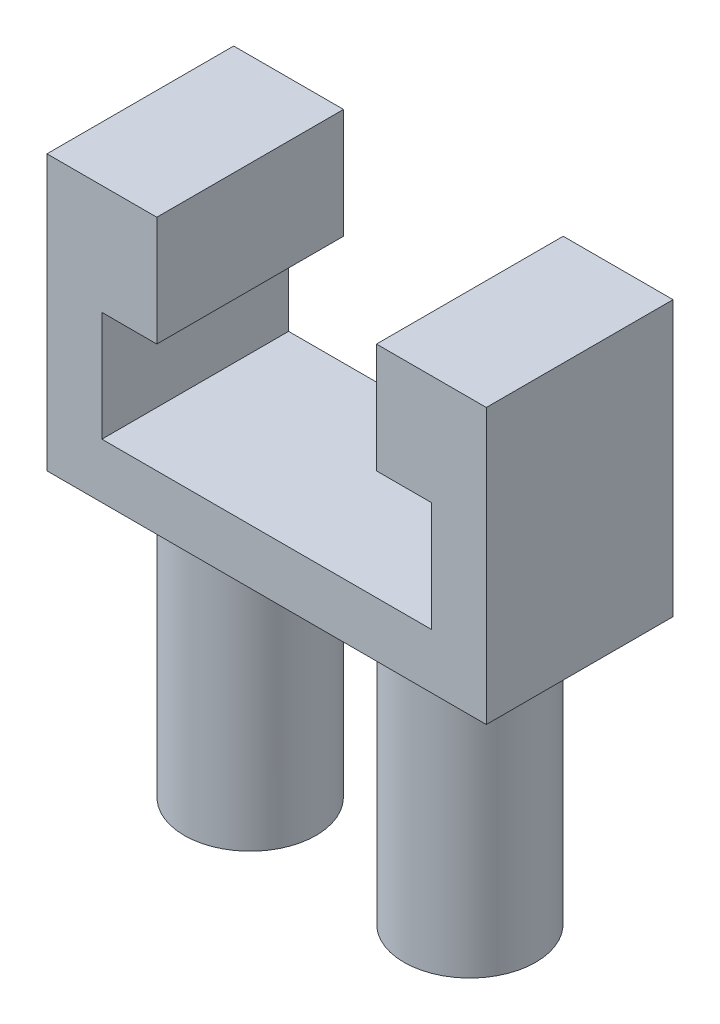
ISO-10303-21;
HEADER;
FILE_DESCRIPTION(('STEP AP214'),'2;1');
FILE_NAME('part.step','',(''),(''),'','','');
FILE_SCHEMA(('AUTOMOTIVE_DESIGN { 1 0 10303 214 1 1 1 1 }'));
ENDSEC;
DATA;
#1=APPLICATION_CONTEXT('core data for automotive mechanical design processes');
#2=APPLICATION_PROTOCOL_DEFINITION('international standard','automotive_design',2000,#1);
#3=PRODUCT_CONTEXT('',#1,'mechanical');
#4=PRODUCT('Part','Part','',(#3));
#5=PRODUCT_RELATED_PRODUCT_CATEGORY('part','',(#4));
#6=PRODUCT_DEFINITION_FORMATION('','',#4);
#7=PRODUCT_DEFINITION_CONTEXT('part definition',#1,'design');
#8=PRODUCT_DEFINITION('design','',#6,#7);
#9=PRODUCT_DEFINITION_SHAPE('','',#8);
#10=(LENGTH_UNIT() NAMED_UNIT(*) SI_UNIT(.MILLI.,.METRE.));
#11=(NAMED_UNIT(*) PLANE_ANGLE_UNIT() SI_UNIT($,.RADIAN.));
#12=(NAMED_UNIT(*) SI_UNIT($,.STERADIAN.) SOLID_ANGLE_UNIT());
#13=UNCERTAINTY_MEASURE_WITH_UNIT(LENGTH_MEASURE(1.E-05),#10,'distance_accuracy_value','');
#14=(GEOMETRIC_REPRESENTATION_CONTEXT(3) GLOBAL_UNCERTAINTY_ASSIGNED_CONTEXT((#13)) GLOBAL_UNIT_ASSIGNED_CONTEXT((#10,
#11,#12)) REPRESENTATION_CONTEXT('',''));
#15=CARTESIAN_POINT('',(0.,0.,0.));
#16=DIRECTION('',(0.,0.,1.));
#17=DIRECTION('',(1.,0.,0.));
#18=AXIS2_PLACEMENT_3D('',#15,#16,#17);
#19=CARTESIAN_POINT('',(6.,-20.,-6.));
#20=DIRECTION('',(0.,1.,0.));
#21=DIRECTION('',(0.,0.,1.));
#22=AXIS2_PLACEMENT_3D('',#19,#20,#21);
#23=CYLINDRICAL_SURFACE('',#22,6.);
#24=CARTESIAN_POINT('',(6.,0.,-6.));
#25=DIRECTION('',(0.,-1.,0.));
#26=DIRECTION('',(0.,0.,-1.));
#27=AXIS2_PLACEMENT_3D('',#24,#25,#26);
#28=CIRCLE('',#27,6.);
#29=CARTESIAN_POINT('',(6.,0.,-12.));
#30=VERTEX_POINT('',#29);
#31=EDGE_CURVE('E231',#30,#30,#28,.T.);
#32=ORIENTED_EDGE('',*,*,#31,.T.);
#33=EDGE_LOOP('',(#32));
#34=FACE_BOUND('',#33,.T.);
#35=CARTESIAN_POINT('',(6.,-25.,-6.));
#36=DIRECTION('',(0.,1.,0.));
#37=DIRECTION('',(0.,0.,1.));
#38=AXIS2_PLACEMENT_3D('',#35,#36,#37);
#39=CIRCLE('',#38,6.);
#40=CARTESIAN_POINT('',(6.,-25.,0.));
#41=VERTEX_POINT('',#40);
#42=EDGE_CURVE('E225',#41,#41,#39,.T.);
#43=ORIENTED_EDGE('',*,*,#42,.T.);
#44=EDGE_LOOP('',(#43));
#45=FACE_BOUND('',#44,.T.);
#46=ADVANCED_FACE('F48',(#34,#45),#23,.T.);
#47=CARTESIAN_POINT('',(0.,25.,0.));
#48=DIRECTION('',(0.,1.,0.));
#49=DIRECTION('',(0.,0.,1.));
#50=AXIS2_PLACEMENT_3D('',#47,#48,#49);
#51=PLANE('',#50);
#52=DIRECTION('',(0.,0.,1.));
#53=VECTOR('',#52,1.);
#54=CARTESIAN_POINT('',(-4.,25.,-12.));
#55=LINE('',#54,#53);
#56=CARTESIAN_POINT('',(-4.,25.,-14.5));
#57=VERTEX_POINT('',#56);
#58=CARTESIAN_POINT('',(-4.,25.,2.5));
#59=VERTEX_POINT('',#58);
#60=EDGE_CURVE('E63',#57,#59,#55,.T.);
#61=ORIENTED_EDGE('',*,*,#60,.T.);
#62=DIRECTION('',(-1.,0.,0.));
#63=VECTOR('',#62,1.);
#64=CARTESIAN_POINT('',(-4.,25.,2.5));
#65=LINE('',#64,#63);
#66=CARTESIAN_POINT('',(6.,25.,2.5));
#67=VERTEX_POINT('',#66);
#68=EDGE_CURVE('E220',#67,#59,#65,.T.);
#69=ORIENTED_EDGE('',*,*,#68,.F.);
#70=DIRECTION('',(0.,0.,-1.));
#71=VECTOR('',#70,1.);
#72=CARTESIAN_POINT('',(6.,25.,76.7402273908541));
#73=LINE('',#72,#71);
#74=CARTESIAN_POINT('',(6.,25.,-14.5));
#75=VERTEX_POINT('',#74);
#76=EDGE_CURVE('E71',#67,#75,#73,.T.);
#77=ORIENTED_EDGE('',*,*,#76,.T.);
#78=DIRECTION('',(1.,0.,0.));
#79=VECTOR('',#78,1.);
#80=CARTESIAN_POINT('',(6.,25.,-14.5));
#81=LINE('',#80,#79);
#82=EDGE_CURVE('E167',#57,#75,#81,.T.);
#83=ORIENTED_EDGE('',*,*,#82,.F.);
#84=EDGE_LOOP('',(#61,#69,#77,#83));
#85=FACE_BOUND('',#84,.T.);
#86=ADVANCED_FACE('F271',(#85),#51,.T.);
#87=CARTESIAN_POINT('',(0.,0.,0.));
#88=DIRECTION('',(0.,-1.,0.));
#89=DIRECTION('',(0.,0.,-1.));
#90=AXIS2_PLACEMENT_3D('',#87,#88,#89);
#91=PLANE('',#90);
#92=CARTESIAN_POINT('',(26.,0.,-6.));
#93=DIRECTION('',(0.,-1.,0.));
#94=DIRECTION('',(0.,0.,-1.));
#95=AXIS2_PLACEMENT_3D('',#92,#93,#94);
#96=CIRCLE('',#95,6.);
#97=CARTESIAN_POINT('',(26.,0.,-12.));
#98=VERTEX_POINT('',#97);
#99=EDGE_CURVE('E228',#98,#98,#96,.T.);
#100=ORIENTED_EDGE('',*,*,#99,.F.);
#101=EDGE_LOOP('',(#100));
#102=FACE_BOUND('',#101,.T.);
#103=ORIENTED_EDGE('',*,*,#31,.F.);
#104=EDGE_LOOP('',(#103));
#105=FACE_BOUND('',#104,.T.);
#106=DIRECTION('',(0.,0.,1.));
#107=VECTOR('',#106,1.);
#108=CARTESIAN_POINT('',(36.,0.,-12.));
#109=LINE('',#108,#107);
#110=CARTESIAN_POINT('',(36.,0.,-14.5));
#111=VERTEX_POINT('',#110);
#112=CARTESIAN_POINT('',(36.,0.,2.5));
#113=VERTEX_POINT('',#112);
#114=EDGE_CURVE('E139',#111,#113,#109,.T.);
#115=ORIENTED_EDGE('',*,*,#114,.T.);
#116=DIRECTION('',(1.,0.,0.));
#117=VECTOR('',#116,1.);
#118=CARTESIAN_POINT('',(36.,0.,2.5));
#119=LINE('',#118,#117);
#120=CARTESIAN_POINT('',(-4.,0.,2.5));
#121=VERTEX_POINT('',#120);
#122=EDGE_CURVE('E194',#121,#113,#119,.T.);
#123=ORIENTED_EDGE('',*,*,#122,.F.);
#124=DIRECTION('',(0.,0.,1.));
#125=VECTOR('',#124,1.);
#126=CARTESIAN_POINT('',(-4.,0.,-12.));
#127=LINE('',#126,#125);
#128=CARTESIAN_POINT('',(-4.,0.,-14.5));
#129=VERTEX_POINT('',#128);
#130=EDGE_CURVE('E153',#129,#121,#127,.T.);
#131=ORIENTED_EDGE('',*,*,#130,.F.);
#132=DIRECTION('',(-1.,0.,0.));
#133=VECTOR('',#132,1.);
#134=CARTESIAN_POINT('',(-4.,0.,-14.5));
#135=LINE('',#134,#133);
#136=EDGE_CURVE('E152',#111,#129,#135,.T.);
#137=ORIENTED_EDGE('',*,*,#136,.F.);
#138=EDGE_LOOP('',(#115,#123,#131,#137));
#139=FACE_BOUND('',#138,.T.);
#140=ADVANCED_FACE('F50',(#102,#105,#139),#91,.T.);
#141=DIRECTION('',(0.,0.,-1.));
#142=VECTOR('',#141,1.);
#143=CARTESIAN_POINT('',(26.,25.,76.7402273908541));
#144=LINE('',#143,#142);
#145=CARTESIAN_POINT('',(26.,25.,2.5));
#146=VERTEX_POINT('',#145);
#147=CARTESIAN_POINT('',(26.,25.,-14.5));
#148=VERTEX_POINT('',#147);
#149=EDGE_CURVE('E234',#146,#148,#144,.T.);
#150=ORIENTED_EDGE('',*,*,#149,.F.);
#151=DIRECTION('',(-1.,0.,0.));
#152=VECTOR('',#151,1.);
#153=CARTESIAN_POINT('',(26.,25.,2.5));
#154=LINE('',#153,#152);
#155=CARTESIAN_POINT('',(36.,25.,2.5));
#156=VERTEX_POINT('',#155);
#157=EDGE_CURVE('E197',#156,#146,#154,.T.);
#158=ORIENTED_EDGE('',*,*,#157,.F.);
#159=DIRECTION('',(0.,0.,1.));
#160=VECTOR('',#159,1.);
#161=CARTESIAN_POINT('',(36.,25.,-12.));
#162=LINE('',#161,#160);
#163=CARTESIAN_POINT('',(36.,25.,-14.5));
#164=VERTEX_POINT('',#163);
#165=EDGE_CURVE('E149',#164,#156,#162,.T.);
#166=ORIENTED_EDGE('',*,*,#165,.F.);
#167=DIRECTION('',(1.,0.,0.));
#168=VECTOR('',#167,1.);
#169=CARTESIAN_POINT('',(36.,25.,-14.5));
#170=LINE('',#169,#168);
#171=EDGE_CURVE('E163',#148,#164,#170,.T.);
#172=ORIENTED_EDGE('',*,*,#171,.F.);
#173=EDGE_LOOP('',(#150,#158,#166,#172));
#174=FACE_BOUND('',#173,.T.);
#175=ADVANCED_FACE('F277',(#174),#51,.T.);
#176=CARTESIAN_POINT('',(-4.,0.,-12.));
#177=DIRECTION('',(1.,0.,0.));
#178=DIRECTION('',(0.,0.,-1.));
#179=AXIS2_PLACEMENT_3D('',#176,#177,#178);
#180=PLANE('',#179);
#181=ORIENTED_EDGE('',*,*,#130,.T.);
#182=DIRECTION('',(0.,-1.,0.));
#183=VECTOR('',#182,1.);
#184=CARTESIAN_POINT('',(-4.,0.,2.5));
#185=LINE('',#184,#183);
#186=EDGE_CURVE('E191',#59,#121,#185,.T.);
#187=ORIENTED_EDGE('',*,*,#186,.F.);
#188=ORIENTED_EDGE('',*,*,#60,.F.);
#189=DIRECTION('',(0.,1.,0.));
#190=VECTOR('',#189,1.);
#191=CARTESIAN_POINT('',(-4.,25.,-14.5));
#192=LINE('',#191,#190);
#193=EDGE_CURVE('E157',#129,#57,#192,.T.);
#194=ORIENTED_EDGE('',*,*,#193,.F.);
#195=EDGE_LOOP('',(#181,#187,#188,#194));
#196=FACE_BOUND('',#195,.T.);
#197=ADVANCED_FACE('F310',(#196),#180,.F.);
#198=CARTESIAN_POINT('',(36.,0.,-12.));
#199=DIRECTION('',(1.,0.,0.));
#200=DIRECTION('',(0.,0.,-1.));
#201=AXIS2_PLACEMENT_3D('',#198,#199,#200);
#202=PLANE('',#201);
#203=ORIENTED_EDGE('',*,*,#165,.T.);
#204=DIRECTION('',(0.,1.,0.));
#205=VECTOR('',#204,1.);
#206=CARTESIAN_POINT('',(36.,25.,2.5));
#207=LINE('',#206,#205);
#208=EDGE_CURVE('E145',#113,#156,#207,.T.);
#209=ORIENTED_EDGE('',*,*,#208,.F.);
#210=ORIENTED_EDGE('',*,*,#114,.F.);
#211=DIRECTION('',(0.,-1.,0.));
#212=VECTOR('',#211,1.);
#213=CARTESIAN_POINT('',(36.,0.,-14.5));
#214=LINE('',#213,#212);
#215=EDGE_CURVE('E143',#164,#111,#214,.T.);
#216=ORIENTED_EDGE('',*,*,#215,.F.);
#217=EDGE_LOOP('',(#203,#209,#210,#216));
#218=FACE_BOUND('',#217,.T.);
#219=ADVANCED_FACE('F141',(#218),#202,.T.);
#220=CARTESIAN_POINT('',(6.,15.,76.7402273908541));
#221=DIRECTION('',(-1.,0.,0.));
#222=DIRECTION('',(0.,0.,1.));
#223=AXIS2_PLACEMENT_3D('',#220,#221,#222);
#224=PLANE('',#223);
#225=ORIENTED_EDGE('',*,*,#76,.F.);
#226=DIRECTION('',(0.,1.,0.));
#227=VECTOR('',#226,1.);
#228=CARTESIAN_POINT('',(6.,25.,2.5));
#229=LINE('',#228,#227);
#230=CARTESIAN_POINT('',(6.,15.,2.5));
#231=VERTEX_POINT('',#230);
#232=EDGE_CURVE('E218',#231,#67,#229,.T.);
#233=ORIENTED_EDGE('',*,*,#232,.F.);
#234=DIRECTION('',(0.,0.,-1.));
#235=VECTOR('',#234,1.);
#236=CARTESIAN_POINT('',(6.,15.,76.7402273908541));
#237=LINE('',#236,#235);
#238=CARTESIAN_POINT('',(6.,15.,-14.5));
#239=VERTEX_POINT('',#238);
#240=EDGE_CURVE('E247',#231,#239,#237,.T.);
#241=ORIENTED_EDGE('',*,*,#240,.T.);
#242=DIRECTION('',(0.,-1.,0.));
#243=VECTOR('',#242,1.);
#244=CARTESIAN_POINT('',(6.,15.,-14.5));
#245=LINE('',#244,#243);
#246=EDGE_CURVE('E170',#75,#239,#245,.T.);
#247=ORIENTED_EDGE('',*,*,#246,.F.);
#248=EDGE_LOOP('',(#225,#233,#241,#247));
#249=FACE_BOUND('',#248,.T.);
#250=ADVANCED_FACE('F304',(#249),#224,.F.);
#251=CARTESIAN_POINT('',(0.999999999999999,15.,76.7402273908541));
#252=DIRECTION('',(0.,1.,0.));
#253=DIRECTION('',(0.,0.,1.));
#254=AXIS2_PLACEMENT_3D('',#251,#252,#253);
#255=PLANE('',#254);
#256=ORIENTED_EDGE('',*,*,#240,.F.);
#257=DIRECTION('',(1.,0.,0.));
#258=VECTOR('',#257,1.);
#259=CARTESIAN_POINT('',(6.,15.,2.5));
#260=LINE('',#259,#258);
#261=CARTESIAN_POINT('',(0.999999999999999,15.,2.5));
#262=VERTEX_POINT('',#261);
#263=EDGE_CURVE('E215',#262,#231,#260,.T.);
#264=ORIENTED_EDGE('',*,*,#263,.F.);
#265=DIRECTION('',(0.,0.,-1.));
#266=VECTOR('',#265,1.);
#267=CARTESIAN_POINT('',(0.999999999999999,15.,76.7402273908541));
#268=LINE('',#267,#266);
#269=CARTESIAN_POINT('',(0.999999999999999,15.,-14.5));
#270=VERTEX_POINT('',#269);
#271=EDGE_CURVE('E244',#262,#270,#268,.T.);
#272=ORIENTED_EDGE('',*,*,#271,.T.);
#273=DIRECTION('',(-1.,0.,0.));
#274=VECTOR('',#273,1.);
#275=CARTESIAN_POINT('',(0.999999999999999,15.,-14.5));
#276=LINE('',#275,#274);
#277=EDGE_CURVE('E173',#239,#270,#276,.T.);
#278=ORIENTED_EDGE('',*,*,#277,.F.);
#279=EDGE_LOOP('',(#256,#264,#272,#278));
#280=FACE_BOUND('',#279,.T.);
#281=ADVANCED_FACE('F300',(#280),#255,.F.);
#282=CARTESIAN_POINT('',(0.999999999999999,5.,76.7402273908541));
#283=DIRECTION('',(-1.,0.,0.));
#284=DIRECTION('',(0.,0.,1.));
#285=AXIS2_PLACEMENT_3D('',#282,#283,#284);
#286=PLANE('',#285);
#287=ORIENTED_EDGE('',*,*,#271,.F.);
#288=DIRECTION('',(0.,1.,0.));
#289=VECTOR('',#288,1.);
#290=CARTESIAN_POINT('',(0.999999999999999,15.,2.5));
#291=LINE('',#290,#289);
#292=CARTESIAN_POINT('',(0.999999999999999,5.,2.5));
#293=VERTEX_POINT('',#292);
#294=EDGE_CURVE('E212',#293,#262,#291,.T.);
#295=ORIENTED_EDGE('',*,*,#294,.F.);
#296=DIRECTION('',(0.,0.,-1.));
#297=VECTOR('',#296,1.);
#298=CARTESIAN_POINT('',(0.999999999999999,5.,76.7402273908541));
#299=LINE('',#298,#297);
#300=CARTESIAN_POINT('',(0.999999999999999,5.,-14.5));
#301=VERTEX_POINT('',#300);
#302=EDGE_CURVE('E242',#293,#301,#299,.T.);
#303=ORIENTED_EDGE('',*,*,#302,.T.);
#304=DIRECTION('',(0.,-1.,0.));
#305=VECTOR('',#304,1.);
#306=CARTESIAN_POINT('',(0.999999999999999,5.,-14.5));
#307=LINE('',#306,#305);
#308=EDGE_CURVE('E176',#270,#301,#307,.T.);
#309=ORIENTED_EDGE('',*,*,#308,.F.);
#310=EDGE_LOOP('',(#287,#295,#303,#309));
#311=FACE_BOUND('',#310,.T.);
#312=ADVANCED_FACE('F297',(#311),#286,.F.);
#313=CARTESIAN_POINT('',(0.999999999999999,5.,76.7402273908541));
#314=DIRECTION('',(0.,-1.,0.));
#315=DIRECTION('',(0.,0.,-1.));
#316=AXIS2_PLACEMENT_3D('',#313,#314,#315);
#317=PLANE('',#316);
#318=ORIENTED_EDGE('',*,*,#302,.F.);
#319=DIRECTION('',(-1.,0.,0.));
#320=VECTOR('',#319,1.);
#321=CARTESIAN_POINT('',(0.999999999999999,5.,2.5));
#322=LINE('',#321,#320);
#323=CARTESIAN_POINT('',(31.,5.,2.5));
#324=VERTEX_POINT('',#323);
#325=EDGE_CURVE('E209',#324,#293,#322,.T.);
#326=ORIENTED_EDGE('',*,*,#325,.F.);
#327=DIRECTION('',(0.,0.,-1.));
#328=VECTOR('',#327,1.);
#329=CARTESIAN_POINT('',(31.,5.,76.7402273908541));
#330=LINE('',#329,#328);
#331=CARTESIAN_POINT('',(31.,5.,-14.5));
#332=VERTEX_POINT('',#331);
#333=EDGE_CURVE('E240',#324,#332,#330,.T.);
#334=ORIENTED_EDGE('',*,*,#333,.T.);
#335=DIRECTION('',(1.,0.,0.));
#336=VECTOR('',#335,1.);
#337=CARTESIAN_POINT('',(31.,5.,-14.5));
#338=LINE('',#337,#336);
#339=EDGE_CURVE('E179',#301,#332,#338,.T.);
#340=ORIENTED_EDGE('',*,*,#339,.F.);
#341=EDGE_LOOP('',(#318,#326,#334,#340));
#342=FACE_BOUND('',#341,.T.);
#343=ADVANCED_FACE('F293',(#342),#317,.F.);
#344=CARTESIAN_POINT('',(31.,5.,76.7402273908541));
#345=DIRECTION('',(1.,0.,0.));
#346=DIRECTION('',(0.,0.,-1.));
#347=AXIS2_PLACEMENT_3D('',#344,#345,#346);
#348=PLANE('',#347);
#349=ORIENTED_EDGE('',*,*,#333,.F.);
#350=DIRECTION('',(0.,-1.,0.));
#351=VECTOR('',#350,1.);
#352=CARTESIAN_POINT('',(31.,5.,2.5));
#353=LINE('',#352,#351);
#354=CARTESIAN_POINT('',(31.,15.,2.5));
#355=VERTEX_POINT('',#354);
#356=EDGE_CURVE('E206',#355,#324,#353,.T.);
#357=ORIENTED_EDGE('',*,*,#356,.F.);
#358=DIRECTION('',(0.,0.,-1.));
#359=VECTOR('',#358,1.);
#360=CARTESIAN_POINT('',(31.,15.,76.7402273908541));
#361=LINE('',#360,#359);
#362=CARTESIAN_POINT('',(31.,15.,-14.5));
#363=VERTEX_POINT('',#362);
#364=EDGE_CURVE('E238',#355,#363,#361,.T.);
#365=ORIENTED_EDGE('',*,*,#364,.T.);
#366=DIRECTION('',(0.,1.,0.));
#367=VECTOR('',#366,1.);
#368=CARTESIAN_POINT('',(31.,15.,-14.5));
#369=LINE('',#368,#367);
#370=EDGE_CURVE('E182',#332,#363,#369,.T.);
#371=ORIENTED_EDGE('',*,*,#370,.F.);
#372=EDGE_LOOP('',(#349,#357,#365,#371));
#373=FACE_BOUND('',#372,.T.);
#374=ADVANCED_FACE('F289',(#373),#348,.F.);
#375=CARTESIAN_POINT('',(31.,15.,76.7402273908541));
#376=DIRECTION('',(0.,1.,0.));
#377=DIRECTION('',(0.,0.,1.));
#378=AXIS2_PLACEMENT_3D('',#375,#376,#377);
#379=PLANE('',#378);
#380=ORIENTED_EDGE('',*,*,#364,.F.);
#381=DIRECTION('',(1.,0.,0.));
#382=VECTOR('',#381,1.);
#383=CARTESIAN_POINT('',(31.,15.,2.5));
#384=LINE('',#383,#382);
#385=CARTESIAN_POINT('',(26.,15.,2.5));
#386=VERTEX_POINT('',#385);
#387=EDGE_CURVE('E203',#386,#355,#384,.T.);
#388=ORIENTED_EDGE('',*,*,#387,.F.);
#389=DIRECTION('',(0.,0.,-1.));
#390=VECTOR('',#389,1.);
#391=CARTESIAN_POINT('',(26.,15.,76.7402273908541));
#392=LINE('',#391,#390);
#393=CARTESIAN_POINT('',(26.,15.,-14.5));
#394=VERTEX_POINT('',#393);
#395=EDGE_CURVE('E236',#386,#394,#392,.T.);
#396=ORIENTED_EDGE('',*,*,#395,.T.);
#397=DIRECTION('',(-1.,0.,0.));
#398=VECTOR('',#397,1.);
#399=CARTESIAN_POINT('',(26.,15.,-14.5));
#400=LINE('',#399,#398);
#401=EDGE_CURVE('E185',#363,#394,#400,.T.);
#402=ORIENTED_EDGE('',*,*,#401,.F.);
#403=EDGE_LOOP('',(#380,#388,#396,#402));
#404=FACE_BOUND('',#403,.T.);
#405=ADVANCED_FACE('F285',(#404),#379,.F.);
#406=CARTESIAN_POINT('',(26.,15.,76.7402273908541));
#407=DIRECTION('',(1.,0.,0.));
#408=DIRECTION('',(0.,0.,-1.));
#409=AXIS2_PLACEMENT_3D('',#406,#407,#408);
#410=PLANE('',#409);
#411=ORIENTED_EDGE('',*,*,#395,.F.);
#412=DIRECTION('',(0.,-1.,0.));
#413=VECTOR('',#412,1.);
#414=CARTESIAN_POINT('',(26.,15.,2.5));
#415=LINE('',#414,#413);
#416=EDGE_CURVE('E200',#146,#386,#415,.T.);
#417=ORIENTED_EDGE('',*,*,#416,.F.);
#418=ORIENTED_EDGE('',*,*,#149,.T.);
#419=DIRECTION('',(0.,1.,0.));
#420=VECTOR('',#419,1.);
#421=CARTESIAN_POINT('',(26.,25.,-14.5));
#422=LINE('',#421,#420);
#423=EDGE_CURVE('E188',#394,#148,#422,.T.);
#424=ORIENTED_EDGE('',*,*,#423,.F.);
#425=EDGE_LOOP('',(#411,#417,#418,#424));
#426=FACE_BOUND('',#425,.T.);
#427=ADVANCED_FACE('F282',(#426),#410,.F.);
#428=CARTESIAN_POINT('',(26.,-20.,-6.));
#429=DIRECTION('',(0.,1.,0.));
#430=DIRECTION('',(0.,0.,1.));
#431=AXIS2_PLACEMENT_3D('',#428,#429,#430);
#432=CYLINDRICAL_SURFACE('',#431,6.);
#433=ORIENTED_EDGE('',*,*,#99,.T.);
#434=EDGE_LOOP('',(#433));
#435=FACE_BOUND('',#434,.T.);
#436=CARTESIAN_POINT('',(26.,-25.,-6.));
#437=DIRECTION('',(0.,1.,0.));
#438=DIRECTION('',(0.,0.,1.));
#439=AXIS2_PLACEMENT_3D('',#436,#437,#438);
#440=CIRCLE('',#439,6.);
#441=CARTESIAN_POINT('',(26.,-25.,0.));
#442=VERTEX_POINT('',#441);
#443=EDGE_CURVE('E222',#442,#442,#440,.T.);
#444=ORIENTED_EDGE('',*,*,#443,.T.);
#445=EDGE_LOOP('',(#444));
#446=FACE_BOUND('',#445,.T.);
#447=ADVANCED_FACE('F266',(#435,#446),#432,.T.);
#448=CARTESIAN_POINT('',(6.,-20.,-6.));
#449=DIRECTION('',(0.,-1.,0.));
#450=DIRECTION('',(0.,0.,-1.));
#451=AXIS2_PLACEMENT_3D('',#448,#449,#450);
#452=CONICAL_SURFACE('',#451,5.8,0.0399786871232901);
#453=ORIENTED_EDGE('',*,*,#42,.F.);
#454=EDGE_LOOP('',(#453));
#455=FACE_BOUND('',#454,.T.);
#456=CARTESIAN_POINT('',(6.,-20.,-6.));
#457=DIRECTION('',(0.,1.,0.));
#458=DIRECTION('',(0.,0.,1.));
#459=AXIS2_PLACEMENT_3D('',#456,#457,#458);
#460=CIRCLE('',#459,5.8);
#461=CARTESIAN_POINT('',(6.,-20.,-0.200000000000001));
#462=VERTEX_POINT('',#461);
#463=EDGE_CURVE('E56',#462,#462,#460,.T.);
#464=ORIENTED_EDGE('',*,*,#463,.T.);
#465=EDGE_LOOP('',(#464));
#466=FACE_BOUND('',#465,.T.);
#467=ADVANCED_FACE('F254',(#455,#466),#452,.F.);
#468=CARTESIAN_POINT('',(6.,-20.,-6.));
#469=DIRECTION('',(0.,1.,0.));
#470=DIRECTION('',(0.,0.,1.));
#471=AXIS2_PLACEMENT_3D('',#468,#469,#470);
#472=PLANE('',#471);
#473=ORIENTED_EDGE('',*,*,#463,.F.);
#474=EDGE_LOOP('',(#473));
#475=FACE_BOUND('',#474,.T.);
#476=ADVANCED_FACE('F256',(#475),#472,.F.);
#477=CARTESIAN_POINT('',(26.,-25.,-6.));
#478=DIRECTION('',(0.,-1.,0.));
#479=DIRECTION('',(0.,0.,-1.));
#480=AXIS2_PLACEMENT_3D('',#477,#478,#479);
#481=CONICAL_SURFACE('',#480,6.,0.0399786871232898);
#482=CARTESIAN_POINT('',(26.,-20.,-6.));
#483=DIRECTION('',(0.,-1.,0.));
#484=DIRECTION('',(0.,0.,-1.));
#485=AXIS2_PLACEMENT_3D('',#482,#483,#484);
#486=CIRCLE('',#485,5.8);
#487=CARTESIAN_POINT('',(26.,-20.,-11.8));
#488=VERTEX_POINT('',#487);
#489=EDGE_CURVE('E12',#488,#488,#486,.F.);
#490=ORIENTED_EDGE('',*,*,#489,.T.);
#491=EDGE_LOOP('',(#490));
#492=FACE_BOUND('',#491,.T.);
#493=ORIENTED_EDGE('',*,*,#443,.F.);
#494=EDGE_LOOP('',(#493));
#495=FACE_BOUND('',#494,.T.);
#496=ADVANCED_FACE('F258',(#492,#495),#481,.F.);
#497=CARTESIAN_POINT('',(26.,-20.,-6.));
#498=DIRECTION('',(0.,-1.,0.));
#499=DIRECTION('',(0.,0.,-1.));
#500=AXIS2_PLACEMENT_3D('',#497,#498,#499);
#501=PLANE('',#500);
#502=ORIENTED_EDGE('',*,*,#489,.F.);
#503=EDGE_LOOP('',(#502));
#504=FACE_BOUND('',#503,.T.);
#505=ADVANCED_FACE('F263',(#504),#501,.T.);
#506=CARTESIAN_POINT('',(0.,0.,2.5));
#507=DIRECTION('',(0.,0.,-1.));
#508=DIRECTION('',(-1.,0.,0.));
#509=AXIS2_PLACEMENT_3D('',#506,#507,#508);
#510=PLANE('',#509);
#511=ORIENTED_EDGE('',*,*,#186,.T.);
#512=ORIENTED_EDGE('',*,*,#122,.T.);
#513=ORIENTED_EDGE('',*,*,#208,.T.);
#514=ORIENTED_EDGE('',*,*,#157,.T.);
#515=ORIENTED_EDGE('',*,*,#416,.T.);
#516=ORIENTED_EDGE('',*,*,#387,.T.);
#517=ORIENTED_EDGE('',*,*,#356,.T.);
#518=ORIENTED_EDGE('',*,*,#325,.T.);
#519=ORIENTED_EDGE('',*,*,#294,.T.);
#520=ORIENTED_EDGE('',*,*,#263,.T.);
#521=ORIENTED_EDGE('',*,*,#232,.T.);
#522=ORIENTED_EDGE('',*,*,#68,.T.);
#523=EDGE_LOOP('',(#511,#512,#513,#514,#515,#516,#517,#518,#519,#520,#521,#522));
#524=FACE_BOUND('',#523,.T.);
#525=ADVANCED_FACE('F323',(#524),#510,.F.);
#526=CARTESIAN_POINT('',(0.,0.,-14.5));
#527=DIRECTION('',(0.,0.,1.));
#528=DIRECTION('',(1.,0.,0.));
#529=AXIS2_PLACEMENT_3D('',#526,#527,#528);
#530=PLANE('',#529);
#531=ORIENTED_EDGE('',*,*,#215,.T.);
#532=ORIENTED_EDGE('',*,*,#136,.T.);
#533=ORIENTED_EDGE('',*,*,#193,.T.);
#534=ORIENTED_EDGE('',*,*,#82,.T.);
#535=ORIENTED_EDGE('',*,*,#246,.T.);
#536=ORIENTED_EDGE('',*,*,#277,.T.);
#537=ORIENTED_EDGE('',*,*,#308,.T.);
#538=ORIENTED_EDGE('',*,*,#339,.T.);
#539=ORIENTED_EDGE('',*,*,#370,.T.);
#540=ORIENTED_EDGE('',*,*,#401,.T.);
#541=ORIENTED_EDGE('',*,*,#423,.T.);
#542=ORIENTED_EDGE('',*,*,#171,.T.);
#543=EDGE_LOOP('',(#531,#532,#533,#534,#535,#536,#537,#538,#539,#540,#541,#542));
#544=FACE_BOUND('',#543,.T.);
#545=ADVANCED_FACE('F160',(#544),#530,.F.);
#546=CLOSED_SHELL('',(#46,#86,#140,#175,#197,#219,#250,#281,#312,#343,#374,#405,#427,#447,#467,
#476,#496,#505,#525,#545));
#547=MANIFOLD_SOLID_BREP('B2',#546);
#548=ADVANCED_BREP_SHAPE_REPRESENTATION('',(#18,#547),#14);
#549=SHAPE_DEFINITION_REPRESENTATION(#9,#548);
ENDSEC;
END-ISO-10303-21;
